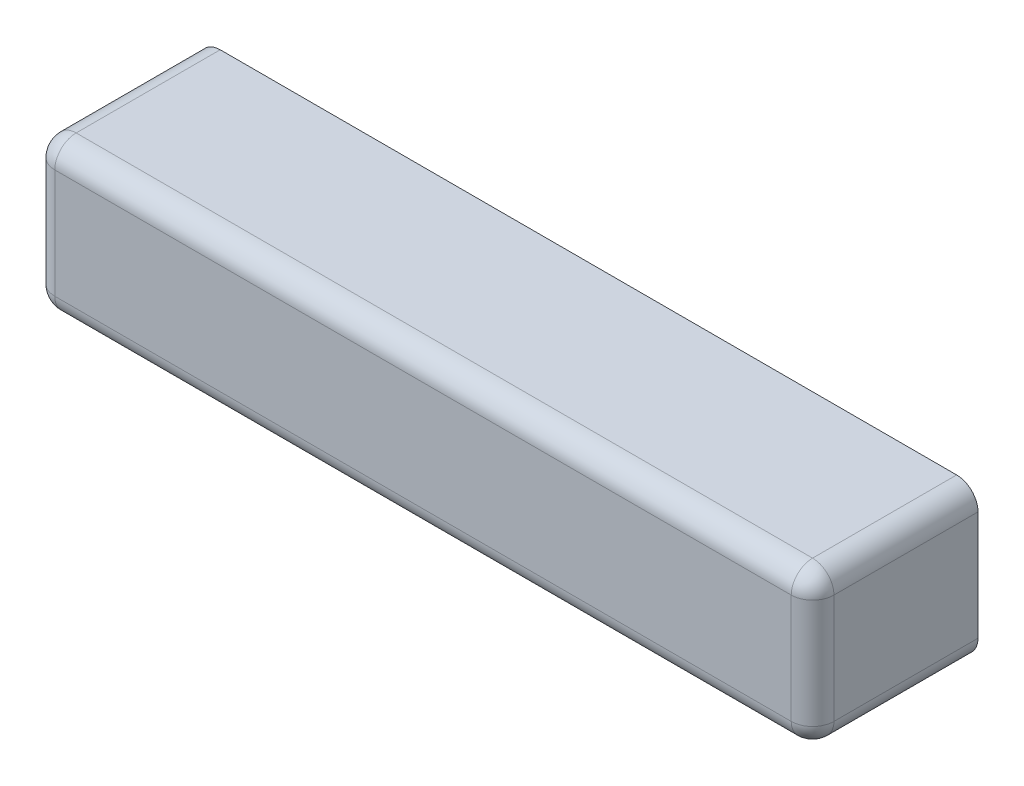
ISO-10303-21;
HEADER;
FILE_DESCRIPTION(('STEP AP214'),'2;1');
FILE_NAME('part.step','',(''),(''),'','','');
FILE_SCHEMA(('AUTOMOTIVE_DESIGN { 1 0 10303 214 1 1 1 1 }'));
ENDSEC;
DATA;
#1=APPLICATION_CONTEXT('core data for automotive mechanical design processes');
#2=APPLICATION_PROTOCOL_DEFINITION('international standard','automotive_design',2000,#1);
#3=PRODUCT_CONTEXT('',#1,'mechanical');
#4=PRODUCT('Part','Part','',(#3));
#5=PRODUCT_RELATED_PRODUCT_CATEGORY('part','',(#4));
#6=PRODUCT_DEFINITION_FORMATION('','',#4);
#7=PRODUCT_DEFINITION_CONTEXT('part definition',#1,'design');
#8=PRODUCT_DEFINITION('design','',#6,#7);
#9=PRODUCT_DEFINITION_SHAPE('','',#8);
#10=(LENGTH_UNIT() NAMED_UNIT(*) SI_UNIT(.MILLI.,.METRE.));
#11=(NAMED_UNIT(*) PLANE_ANGLE_UNIT() SI_UNIT($,.RADIAN.));
#12=(NAMED_UNIT(*) SI_UNIT($,.STERADIAN.) SOLID_ANGLE_UNIT());
#13=UNCERTAINTY_MEASURE_WITH_UNIT(LENGTH_MEASURE(1.E-05),#10,'distance_accuracy_value','');
#14=(GEOMETRIC_REPRESENTATION_CONTEXT(3) GLOBAL_UNCERTAINTY_ASSIGNED_CONTEXT((#13)) GLOBAL_UNIT_ASSIGNED_CONTEXT((#10,
#11,#12)) REPRESENTATION_CONTEXT('',''));
#15=CARTESIAN_POINT('',(0.,0.,0.));
#16=DIRECTION('',(0.,0.,1.));
#17=DIRECTION('',(1.,0.,0.));
#18=AXIS2_PLACEMENT_3D('',#15,#16,#17);
#19=CARTESIAN_POINT('',(0.,0.,6.2));
#20=DIRECTION('',(1.,0.,0.));
#21=DIRECTION('',(0.,0.,-1.));
#22=AXIS2_PLACEMENT_3D('',#19,#20,#21);
#23=PLANE('',#22);
#24=DIRECTION('',(0.,-1.,0.));
#25=VECTOR('',#24,1.);
#26=CARTESIAN_POINT('',(0.,0.,0.));
#27=LINE('',#26,#25);
#28=CARTESIAN_POINT('',(0.,4.9,0.));
#29=VERTEX_POINT('',#28);
#30=CARTESIAN_POINT('',(0.,0.8,0.));
#31=VERTEX_POINT('',#30);
#32=EDGE_CURVE('E197',#29,#31,#27,.T.);
#33=ORIENTED_EDGE('',*,*,#32,.T.);
#34=DIRECTION('',(0.,0.,-1.));
#35=VECTOR('',#34,1.);
#36=CARTESIAN_POINT('',(0.,0.8,6.2));
#37=LINE('',#36,#35);
#38=CARTESIAN_POINT('',(0.,0.8,5.4));
#39=VERTEX_POINT('',#38);
#40=EDGE_CURVE('E49',#31,#39,#37,.F.);
#41=ORIENTED_EDGE('',*,*,#40,.T.);
#42=DIRECTION('',(0.,-1.,0.));
#43=VECTOR('',#42,1.);
#44=CARTESIAN_POINT('',(0.,0.,5.4));
#45=LINE('',#44,#43);
#46=CARTESIAN_POINT('',(0.,4.9,5.4));
#47=VERTEX_POINT('',#46);
#48=EDGE_CURVE('E54',#39,#47,#45,.F.);
#49=ORIENTED_EDGE('',*,*,#48,.T.);
#50=DIRECTION('',(0.,0.,-1.));
#51=VECTOR('',#50,1.);
#52=CARTESIAN_POINT('',(0.,4.9,6.2));
#53=LINE('',#52,#51);
#54=EDGE_CURVE('E166',#47,#29,#53,.T.);
#55=ORIENTED_EDGE('',*,*,#54,.T.);
#56=EDGE_LOOP('',(#33,#41,#49,#55));
#57=FACE_BOUND('',#56,.T.);
#58=ADVANCED_FACE('F32',(#57),#23,.F.);
#59=CARTESIAN_POINT('',(0.,0.,6.2));
#60=DIRECTION('',(0.,1.,0.));
#61=DIRECTION('',(0.,0.,1.));
#62=AXIS2_PLACEMENT_3D('',#59,#60,#61);
#63=PLANE('',#62);
#64=DIRECTION('',(1.,0.,0.));
#65=VECTOR('',#64,1.);
#66=CARTESIAN_POINT('',(0.,0.,0.));
#67=LINE('',#66,#65);
#68=CARTESIAN_POINT('',(0.8,0.,0.));
#69=VERTEX_POINT('',#68);
#70=CARTESIAN_POINT('',(28.4,0.,0.));
#71=VERTEX_POINT('',#70);
#72=EDGE_CURVE('E199',#69,#71,#67,.T.);
#73=ORIENTED_EDGE('',*,*,#72,.T.);
#74=DIRECTION('',(0.,0.,-1.));
#75=VECTOR('',#74,1.);
#76=CARTESIAN_POINT('',(28.4,0.,6.2));
#77=LINE('',#76,#75);
#78=CARTESIAN_POINT('',(28.4,0.,5.4));
#79=VERTEX_POINT('',#78);
#80=EDGE_CURVE('E164',#71,#79,#77,.F.);
#81=ORIENTED_EDGE('',*,*,#80,.T.);
#82=DIRECTION('',(1.,0.,0.));
#83=VECTOR('',#82,1.);
#84=CARTESIAN_POINT('',(0.,0.,5.4));
#85=LINE('',#84,#83);
#86=CARTESIAN_POINT('',(0.8,0.,5.4));
#87=VERTEX_POINT('',#86);
#88=EDGE_CURVE('E162',#79,#87,#85,.F.);
#89=ORIENTED_EDGE('',*,*,#88,.T.);
#90=DIRECTION('',(0.,0.,-1.));
#91=VECTOR('',#90,1.);
#92=CARTESIAN_POINT('',(0.8,0.,6.2));
#93=LINE('',#92,#91);
#94=EDGE_CURVE('E160',#87,#69,#93,.T.);
#95=ORIENTED_EDGE('',*,*,#94,.T.);
#96=EDGE_LOOP('',(#73,#81,#89,#95));
#97=FACE_BOUND('',#96,.T.);
#98=ADVANCED_FACE('F251',(#97),#63,.F.);
#99=CARTESIAN_POINT('',(29.2,0.,6.2));
#100=DIRECTION('',(-1.,0.,0.));
#101=DIRECTION('',(0.,0.,1.));
#102=AXIS2_PLACEMENT_3D('',#99,#100,#101);
#103=PLANE('',#102);
#104=DIRECTION('',(0.,1.,0.));
#105=VECTOR('',#104,1.);
#106=CARTESIAN_POINT('',(29.2,0.,0.));
#107=LINE('',#106,#105);
#108=CARTESIAN_POINT('',(29.2,0.8,0.));
#109=VERTEX_POINT('',#108);
#110=CARTESIAN_POINT('',(29.2,4.9,0.));
#111=VERTEX_POINT('',#110);
#112=EDGE_CURVE('E203',#109,#111,#107,.T.);
#113=ORIENTED_EDGE('',*,*,#112,.T.);
#114=DIRECTION('',(0.,0.,-1.));
#115=VECTOR('',#114,1.);
#116=CARTESIAN_POINT('',(29.2,4.9,6.2));
#117=LINE('',#116,#115);
#118=CARTESIAN_POINT('',(29.2,4.9,5.4));
#119=VERTEX_POINT('',#118);
#120=EDGE_CURVE('E158',#111,#119,#117,.F.);
#121=ORIENTED_EDGE('',*,*,#120,.T.);
#122=DIRECTION('',(0.,1.,0.));
#123=VECTOR('',#122,1.);
#124=CARTESIAN_POINT('',(29.2,0.,5.4));
#125=LINE('',#124,#123);
#126=CARTESIAN_POINT('',(29.2,0.8,5.4));
#127=VERTEX_POINT('',#126);
#128=EDGE_CURVE('E156',#119,#127,#125,.F.);
#129=ORIENTED_EDGE('',*,*,#128,.T.);
#130=DIRECTION('',(0.,0.,-1.));
#131=VECTOR('',#130,1.);
#132=CARTESIAN_POINT('',(29.2,0.8,6.2));
#133=LINE('',#132,#131);
#134=EDGE_CURVE('E154',#127,#109,#133,.T.);
#135=ORIENTED_EDGE('',*,*,#134,.T.);
#136=EDGE_LOOP('',(#113,#121,#129,#135));
#137=FACE_BOUND('',#136,.T.);
#138=ADVANCED_FACE('F256',(#137),#103,.F.);
#139=CARTESIAN_POINT('',(0.,5.7,6.2));
#140=DIRECTION('',(0.,-1.,0.));
#141=DIRECTION('',(0.,0.,-1.));
#142=AXIS2_PLACEMENT_3D('',#139,#140,#141);
#143=PLANE('',#142);
#144=DIRECTION('',(-1.,0.,0.));
#145=VECTOR('',#144,1.);
#146=CARTESIAN_POINT('',(0.,5.7,5.4));
#147=LINE('',#146,#145);
#148=CARTESIAN_POINT('',(0.8,5.7,5.4));
#149=VERTEX_POINT('',#148);
#150=CARTESIAN_POINT('',(28.4,5.7,5.4));
#151=VERTEX_POINT('',#150);
#152=EDGE_CURVE('E117',#149,#151,#147,.F.);
#153=ORIENTED_EDGE('',*,*,#152,.T.);
#154=DIRECTION('',(0.,0.,-1.));
#155=VECTOR('',#154,1.);
#156=CARTESIAN_POINT('',(28.4,5.7,6.2));
#157=LINE('',#156,#155);
#158=CARTESIAN_POINT('',(28.4,5.7,0.));
#159=VERTEX_POINT('',#158);
#160=EDGE_CURVE('E152',#151,#159,#157,.T.);
#161=ORIENTED_EDGE('',*,*,#160,.T.);
#162=DIRECTION('',(-1.,0.,0.));
#163=VECTOR('',#162,1.);
#164=CARTESIAN_POINT('',(0.,5.7,0.));
#165=LINE('',#164,#163);
#166=CARTESIAN_POINT('',(0.8,5.7,0.));
#167=VERTEX_POINT('',#166);
#168=EDGE_CURVE('E139',#159,#167,#165,.T.);
#169=ORIENTED_EDGE('',*,*,#168,.T.);
#170=DIRECTION('',(0.,0.,-1.));
#171=VECTOR('',#170,1.);
#172=CARTESIAN_POINT('',(0.8,5.7,6.2));
#173=LINE('',#172,#171);
#174=EDGE_CURVE('E145',#167,#149,#173,.F.);
#175=ORIENTED_EDGE('',*,*,#174,.T.);
#176=EDGE_LOOP('',(#153,#161,#169,#175));
#177=FACE_BOUND('',#176,.T.);
#178=ADVANCED_FACE('F228',(#177),#143,.F.);
#179=CARTESIAN_POINT('',(0.,0.,6.2));
#180=DIRECTION('',(0.,0.,-1.));
#181=DIRECTION('',(-1.,0.,0.));
#182=AXIS2_PLACEMENT_3D('',#179,#180,#181);
#183=PLANE('',#182);
#184=DIRECTION('',(0.,1.,0.));
#185=VECTOR('',#184,1.);
#186=CARTESIAN_POINT('',(28.4,0.,6.2));
#187=LINE('',#186,#185);
#188=CARTESIAN_POINT('',(28.4,0.8,6.2));
#189=VERTEX_POINT('',#188);
#190=CARTESIAN_POINT('',(28.4,4.9,6.2));
#191=VERTEX_POINT('',#190);
#192=EDGE_CURVE('E143',#189,#191,#187,.T.);
#193=ORIENTED_EDGE('',*,*,#192,.T.);
#194=DIRECTION('',(-1.,0.,0.));
#195=VECTOR('',#194,1.);
#196=CARTESIAN_POINT('',(0.,4.9,6.2));
#197=LINE('',#196,#195);
#198=CARTESIAN_POINT('',(0.8,4.9,6.2));
#199=VERTEX_POINT('',#198);
#200=EDGE_CURVE('E115',#191,#199,#197,.T.);
#201=ORIENTED_EDGE('',*,*,#200,.T.);
#202=DIRECTION('',(0.,-1.,0.));
#203=VECTOR('',#202,1.);
#204=CARTESIAN_POINT('',(0.8,0.,6.2));
#205=LINE('',#204,#203);
#206=CARTESIAN_POINT('',(0.8,0.8,6.2));
#207=VERTEX_POINT('',#206);
#208=EDGE_CURVE('E132',#199,#207,#205,.T.);
#209=ORIENTED_EDGE('',*,*,#208,.T.);
#210=DIRECTION('',(1.,0.,0.));
#211=VECTOR('',#210,1.);
#212=CARTESIAN_POINT('',(0.,0.8,6.2));
#213=LINE('',#212,#211);
#214=EDGE_CURVE('E138',#207,#189,#213,.T.);
#215=ORIENTED_EDGE('',*,*,#214,.T.);
#216=EDGE_LOOP('',(#193,#201,#209,#215));
#217=FACE_BOUND('',#216,.T.);
#218=ADVANCED_FACE('F141',(#217),#183,.F.);
#219=CARTESIAN_POINT('',(0.,0.,0.));
#220=DIRECTION('',(0.,0.,-1.));
#221=DIRECTION('',(-1.,0.,0.));
#222=AXIS2_PLACEMENT_3D('',#219,#220,#221);
#223=PLANE('',#222);
#224=ORIENTED_EDGE('',*,*,#168,.F.);
#225=CARTESIAN_POINT('',(28.4,4.9,0.));
#226=DIRECTION('',(0.,0.,-1.));
#227=DIRECTION('',(-1.,0.,0.));
#228=AXIS2_PLACEMENT_3D('',#225,#226,#227);
#229=CIRCLE('',#228,0.8);
#230=EDGE_CURVE('E11',#159,#111,#229,.T.);
#231=ORIENTED_EDGE('',*,*,#230,.T.);
#232=ORIENTED_EDGE('',*,*,#112,.F.);
#233=CARTESIAN_POINT('',(28.4,0.8,0.));
#234=DIRECTION('',(0.,0.,-1.));
#235=DIRECTION('',(-1.,0.,0.));
#236=AXIS2_PLACEMENT_3D('',#233,#234,#235);
#237=CIRCLE('',#236,0.8);
#238=EDGE_CURVE('E41',#109,#71,#237,.T.);
#239=ORIENTED_EDGE('',*,*,#238,.T.);
#240=ORIENTED_EDGE('',*,*,#72,.F.);
#241=CARTESIAN_POINT('',(0.8,0.8,0.));
#242=DIRECTION('',(0.,0.,-1.));
#243=DIRECTION('',(-1.,0.,0.));
#244=AXIS2_PLACEMENT_3D('',#241,#242,#243);
#245=CIRCLE('',#244,0.8);
#246=EDGE_CURVE('E172',#69,#31,#245,.T.);
#247=ORIENTED_EDGE('',*,*,#246,.T.);
#248=ORIENTED_EDGE('',*,*,#32,.F.);
#249=CARTESIAN_POINT('',(0.8,4.9,0.));
#250=DIRECTION('',(0.,0.,-1.));
#251=DIRECTION('',(-1.,0.,0.));
#252=AXIS2_PLACEMENT_3D('',#249,#250,#251);
#253=CIRCLE('',#252,0.8);
#254=EDGE_CURVE('E170',#29,#167,#253,.T.);
#255=ORIENTED_EDGE('',*,*,#254,.T.);
#256=EDGE_LOOP('',(#224,#231,#232,#239,#240,#247,#248,#255));
#257=FACE_BOUND('',#256,.T.);
#258=ADVANCED_FACE('F234',(#257),#223,.T.);
#259=CARTESIAN_POINT('',(28.4,0.8,6.2));
#260=DIRECTION('',(0.,0.,-1.));
#261=DIRECTION('',(-1.,0.,0.));
#262=AXIS2_PLACEMENT_3D('',#259,#260,#261);
#263=CYLINDRICAL_SURFACE('',#262,0.8);
#264=ORIENTED_EDGE('',*,*,#238,.F.);
#265=ORIENTED_EDGE('',*,*,#134,.F.);
#266=CARTESIAN_POINT('',(28.4,0.8,5.4));
#267=DIRECTION('',(0.,0.,1.));
#268=DIRECTION('',(1.,0.,0.));
#269=AXIS2_PLACEMENT_3D('',#266,#267,#268);
#270=CIRCLE('',#269,0.8);
#271=EDGE_CURVE('E36',#79,#127,#270,.T.);
#272=ORIENTED_EDGE('',*,*,#271,.F.);
#273=ORIENTED_EDGE('',*,*,#80,.F.);
#274=EDGE_LOOP('',(#264,#265,#272,#273));
#275=FACE_BOUND('',#274,.T.);
#276=ADVANCED_FACE('F34',(#275),#263,.T.);
#277=CARTESIAN_POINT('',(0.,0.8,5.4));
#278=DIRECTION('',(1.,0.,0.));
#279=DIRECTION('',(0.,0.,-1.));
#280=AXIS2_PLACEMENT_3D('',#277,#278,#279);
#281=CYLINDRICAL_SURFACE('',#280,0.8);
#282=CARTESIAN_POINT('',(0.8,0.8,5.4));
#283=DIRECTION('',(-1.,0.,0.));
#284=DIRECTION('',(0.,0.,1.));
#285=AXIS2_PLACEMENT_3D('',#282,#283,#284);
#286=CIRCLE('',#285,0.8);
#287=EDGE_CURVE('E189',#87,#207,#286,.T.);
#288=ORIENTED_EDGE('',*,*,#287,.F.);
#289=ORIENTED_EDGE('',*,*,#88,.F.);
#290=CARTESIAN_POINT('',(28.4,0.8,5.4));
#291=DIRECTION('',(1.,0.,0.));
#292=DIRECTION('',(0.,0.,-1.));
#293=AXIS2_PLACEMENT_3D('',#290,#291,#292);
#294=CIRCLE('',#293,0.8);
#295=EDGE_CURVE('E191',#189,#79,#294,.T.);
#296=ORIENTED_EDGE('',*,*,#295,.F.);
#297=ORIENTED_EDGE('',*,*,#214,.F.);
#298=EDGE_LOOP('',(#288,#289,#296,#297));
#299=FACE_BOUND('',#298,.T.);
#300=ADVANCED_FACE('F212',(#299),#281,.T.);
#301=CARTESIAN_POINT('',(0.8,0.8,6.2));
#302=DIRECTION('',(0.,0.,-1.));
#303=DIRECTION('',(-1.,0.,0.));
#304=AXIS2_PLACEMENT_3D('',#301,#302,#303);
#305=CYLINDRICAL_SURFACE('',#304,0.8);
#306=ORIENTED_EDGE('',*,*,#246,.F.);
#307=ORIENTED_EDGE('',*,*,#94,.F.);
#308=CARTESIAN_POINT('',(0.8,0.8,5.4));
#309=DIRECTION('',(0.,0.,1.));
#310=DIRECTION('',(1.,0.,0.));
#311=AXIS2_PLACEMENT_3D('',#308,#309,#310);
#312=CIRCLE('',#311,0.8);
#313=EDGE_CURVE('E186',#39,#87,#312,.T.);
#314=ORIENTED_EDGE('',*,*,#313,.F.);
#315=ORIENTED_EDGE('',*,*,#40,.F.);
#316=EDGE_LOOP('',(#306,#307,#314,#315));
#317=FACE_BOUND('',#316,.T.);
#318=ADVANCED_FACE('F239',(#317),#305,.T.);
#319=CARTESIAN_POINT('',(28.4,0.8,5.4));
#320=DIRECTION('',(0.,0.,1.));
#321=DIRECTION('',(1.,0.,0.));
#322=AXIS2_PLACEMENT_3D('',#319,#320,#321);
#323=SPHERICAL_SURFACE('',#322,0.8);
#324=ORIENTED_EDGE('',*,*,#295,.T.);
#325=ORIENTED_EDGE('',*,*,#271,.T.);
#326=CARTESIAN_POINT('',(28.4,0.8,5.4));
#327=DIRECTION('',(0.,-1.,0.));
#328=DIRECTION('',(0.,0.,-1.));
#329=AXIS2_PLACEMENT_3D('',#326,#327,#328);
#330=CIRCLE('',#329,0.8);
#331=EDGE_CURVE('E183',#189,#127,#330,.F.);
#332=ORIENTED_EDGE('',*,*,#331,.F.);
#333=EDGE_LOOP('',(#324,#325,#332));
#334=FACE_BOUND('',#333,.T.);
#335=ADVANCED_FACE('F213',(#334),#323,.T.);
#336=CARTESIAN_POINT('',(0.8,0.8,5.4));
#337=DIRECTION('',(0.,0.,1.));
#338=DIRECTION('',(1.,0.,0.));
#339=AXIS2_PLACEMENT_3D('',#336,#337,#338);
#340=SPHERICAL_SURFACE('',#339,0.8);
#341=ORIENTED_EDGE('',*,*,#313,.T.);
#342=ORIENTED_EDGE('',*,*,#287,.T.);
#343=CARTESIAN_POINT('',(0.8,0.8,5.4));
#344=DIRECTION('',(0.,-1.,0.));
#345=DIRECTION('',(0.,0.,-1.));
#346=AXIS2_PLACEMENT_3D('',#343,#344,#345);
#347=CIRCLE('',#346,0.8);
#348=EDGE_CURVE('E135',#39,#207,#347,.F.);
#349=ORIENTED_EDGE('',*,*,#348,.F.);
#350=EDGE_LOOP('',(#341,#342,#349));
#351=FACE_BOUND('',#350,.T.);
#352=ADVANCED_FACE('F241',(#351),#340,.T.);
#353=CARTESIAN_POINT('',(28.4,4.9,6.2));
#354=DIRECTION('',(0.,0.,-1.));
#355=DIRECTION('',(-1.,0.,0.));
#356=AXIS2_PLACEMENT_3D('',#353,#354,#355);
#357=CYLINDRICAL_SURFACE('',#356,0.8);
#358=ORIENTED_EDGE('',*,*,#230,.F.);
#359=ORIENTED_EDGE('',*,*,#160,.F.);
#360=CARTESIAN_POINT('',(28.4,4.9,5.4));
#361=DIRECTION('',(0.,0.,1.));
#362=DIRECTION('',(1.,0.,0.));
#363=AXIS2_PLACEMENT_3D('',#360,#361,#362);
#364=CIRCLE('',#363,0.8);
#365=EDGE_CURVE('E179',#119,#151,#364,.T.);
#366=ORIENTED_EDGE('',*,*,#365,.F.);
#367=ORIENTED_EDGE('',*,*,#120,.F.);
#368=EDGE_LOOP('',(#358,#359,#366,#367));
#369=FACE_BOUND('',#368,.T.);
#370=ADVANCED_FACE('F225',(#369),#357,.T.);
#371=CARTESIAN_POINT('',(28.4,0.,5.4));
#372=DIRECTION('',(0.,1.,0.));
#373=DIRECTION('',(0.,0.,1.));
#374=AXIS2_PLACEMENT_3D('',#371,#372,#373);
#375=CYLINDRICAL_SURFACE('',#374,0.8);
#376=ORIENTED_EDGE('',*,*,#331,.T.);
#377=ORIENTED_EDGE('',*,*,#128,.F.);
#378=CARTESIAN_POINT('',(28.4,4.9,5.4));
#379=DIRECTION('',(0.,1.,0.));
#380=DIRECTION('',(0.,0.,1.));
#381=AXIS2_PLACEMENT_3D('',#378,#379,#380);
#382=CIRCLE('',#381,0.8);
#383=EDGE_CURVE('E129',#191,#119,#382,.T.);
#384=ORIENTED_EDGE('',*,*,#383,.F.);
#385=ORIENTED_EDGE('',*,*,#192,.F.);
#386=EDGE_LOOP('',(#376,#377,#384,#385));
#387=FACE_BOUND('',#386,.T.);
#388=ADVANCED_FACE('F216',(#387),#375,.T.);
#389=CARTESIAN_POINT('',(0.8,0.,5.4));
#390=DIRECTION('',(0.,-1.,0.));
#391=DIRECTION('',(0.,0.,-1.));
#392=AXIS2_PLACEMENT_3D('',#389,#390,#391);
#393=CYLINDRICAL_SURFACE('',#392,0.8);
#394=ORIENTED_EDGE('',*,*,#348,.T.);
#395=ORIENTED_EDGE('',*,*,#208,.F.);
#396=CARTESIAN_POINT('',(0.8,4.9,5.4));
#397=DIRECTION('',(0.,1.,0.));
#398=DIRECTION('',(0.,0.,1.));
#399=AXIS2_PLACEMENT_3D('',#396,#397,#398);
#400=CIRCLE('',#399,0.8);
#401=EDGE_CURVE('E123',#47,#199,#400,.T.);
#402=ORIENTED_EDGE('',*,*,#401,.F.);
#403=ORIENTED_EDGE('',*,*,#48,.F.);
#404=EDGE_LOOP('',(#394,#395,#402,#403));
#405=FACE_BOUND('',#404,.T.);
#406=ADVANCED_FACE('F133',(#405),#393,.T.);
#407=CARTESIAN_POINT('',(0.8,4.9,6.2));
#408=DIRECTION('',(0.,0.,-1.));
#409=DIRECTION('',(-1.,0.,0.));
#410=AXIS2_PLACEMENT_3D('',#407,#408,#409);
#411=CYLINDRICAL_SURFACE('',#410,0.8);
#412=ORIENTED_EDGE('',*,*,#254,.F.);
#413=ORIENTED_EDGE('',*,*,#54,.F.);
#414=CARTESIAN_POINT('',(0.8,4.9,5.4));
#415=DIRECTION('',(0.,0.,1.));
#416=DIRECTION('',(1.,0.,0.));
#417=AXIS2_PLACEMENT_3D('',#414,#415,#416);
#418=CIRCLE('',#417,0.8);
#419=EDGE_CURVE('E127',#149,#47,#418,.T.);
#420=ORIENTED_EDGE('',*,*,#419,.F.);
#421=ORIENTED_EDGE('',*,*,#174,.F.);
#422=EDGE_LOOP('',(#412,#413,#420,#421));
#423=FACE_BOUND('',#422,.T.);
#424=ADVANCED_FACE('F232',(#423),#411,.T.);
#425=CARTESIAN_POINT('',(28.4,4.9,5.4));
#426=DIRECTION('',(0.,0.,1.));
#427=DIRECTION('',(1.,0.,0.));
#428=AXIS2_PLACEMENT_3D('',#425,#426,#427);
#429=SPHERICAL_SURFACE('',#428,0.8);
#430=ORIENTED_EDGE('',*,*,#383,.T.);
#431=ORIENTED_EDGE('',*,*,#365,.T.);
#432=CARTESIAN_POINT('',(28.4,4.9,5.4));
#433=DIRECTION('',(1.,0.,0.));
#434=DIRECTION('',(0.,0.,-1.));
#435=AXIS2_PLACEMENT_3D('',#432,#433,#434);
#436=CIRCLE('',#435,0.8);
#437=EDGE_CURVE('E120',#191,#151,#436,.F.);
#438=ORIENTED_EDGE('',*,*,#437,.F.);
#439=EDGE_LOOP('',(#430,#431,#438));
#440=FACE_BOUND('',#439,.T.);
#441=ADVANCED_FACE('F220',(#440),#429,.T.);
#442=CARTESIAN_POINT('',(0.8,4.9,5.4));
#443=DIRECTION('',(0.,0.,1.));
#444=DIRECTION('',(1.,0.,0.));
#445=AXIS2_PLACEMENT_3D('',#442,#443,#444);
#446=SPHERICAL_SURFACE('',#445,0.8);
#447=ORIENTED_EDGE('',*,*,#419,.T.);
#448=ORIENTED_EDGE('',*,*,#401,.T.);
#449=CARTESIAN_POINT('',(0.8,4.9,5.4));
#450=DIRECTION('',(-1.,0.,0.));
#451=DIRECTION('',(0.,0.,1.));
#452=AXIS2_PLACEMENT_3D('',#449,#450,#451);
#453=CIRCLE('',#452,0.8);
#454=EDGE_CURVE('E111',#149,#199,#453,.F.);
#455=ORIENTED_EDGE('',*,*,#454,.F.);
#456=EDGE_LOOP('',(#447,#448,#455));
#457=FACE_BOUND('',#456,.T.);
#458=ADVANCED_FACE('F125',(#457),#446,.T.);
#459=CARTESIAN_POINT('',(0.,4.9,5.4));
#460=DIRECTION('',(-1.,0.,0.));
#461=DIRECTION('',(0.,0.,1.));
#462=AXIS2_PLACEMENT_3D('',#459,#460,#461);
#463=CYLINDRICAL_SURFACE('',#462,0.8);
#464=ORIENTED_EDGE('',*,*,#437,.T.);
#465=ORIENTED_EDGE('',*,*,#152,.F.);
#466=ORIENTED_EDGE('',*,*,#454,.T.);
#467=ORIENTED_EDGE('',*,*,#200,.F.);
#468=EDGE_LOOP('',(#464,#465,#466,#467));
#469=FACE_BOUND('',#468,.T.);
#470=ADVANCED_FACE('F113',(#469),#463,.T.);
#471=CLOSED_SHELL('',(#58,#98,#138,#178,#218,#258,#276,#300,#318,#335,#352,#370,#388,#406,#424,
#441,#458,#470));
#472=MANIFOLD_SOLID_BREP('B2',#471);
#473=ADVANCED_BREP_SHAPE_REPRESENTATION('',(#18,#472),#14);
#474=SHAPE_DEFINITION_REPRESENTATION(#9,#473);
ENDSEC;
END-ISO-10303-21;
